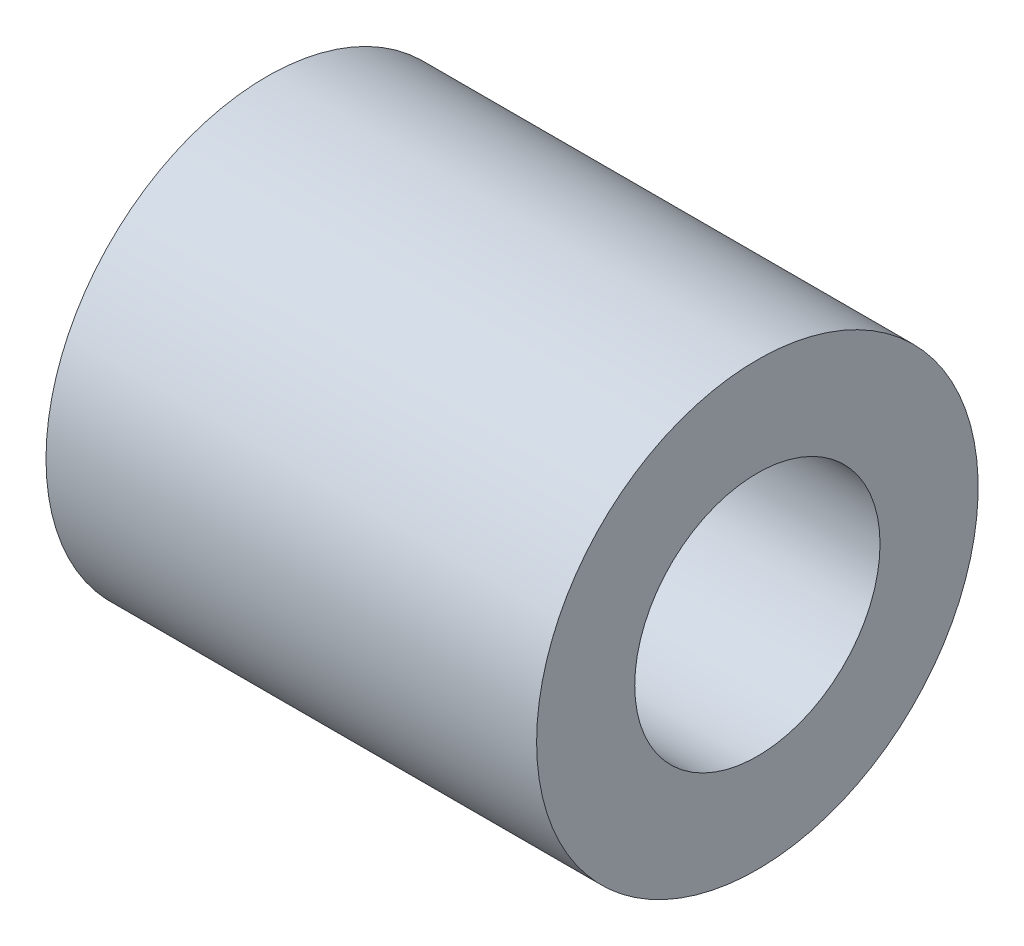
ISO-10303-21;
HEADER;
FILE_DESCRIPTION(('STEP AP214'),'2;1');
FILE_NAME('part.step','',(''),(''),'','','');
FILE_SCHEMA(('AUTOMOTIVE_DESIGN { 1 0 10303 214 1 1 1 1 }'));
ENDSEC;
DATA;
#1=APPLICATION_CONTEXT('core data for automotive mechanical design processes');
#2=APPLICATION_PROTOCOL_DEFINITION('international standard','automotive_design',2000,#1);
#3=PRODUCT_CONTEXT('',#1,'mechanical');
#4=PRODUCT('Part','Part','',(#3));
#5=PRODUCT_RELATED_PRODUCT_CATEGORY('part','',(#4));
#6=PRODUCT_DEFINITION_FORMATION('','',#4);
#7=PRODUCT_DEFINITION_CONTEXT('part definition',#1,'design');
#8=PRODUCT_DEFINITION('design','',#6,#7);
#9=PRODUCT_DEFINITION_SHAPE('','',#8);
#10=(LENGTH_UNIT() NAMED_UNIT(*) SI_UNIT(.MILLI.,.METRE.));
#11=(NAMED_UNIT(*) PLANE_ANGLE_UNIT() SI_UNIT($,.RADIAN.));
#12=(NAMED_UNIT(*) SI_UNIT($,.STERADIAN.) SOLID_ANGLE_UNIT());
#13=UNCERTAINTY_MEASURE_WITH_UNIT(LENGTH_MEASURE(1.E-05),#10,'distance_accuracy_value','');
#14=(GEOMETRIC_REPRESENTATION_CONTEXT(3) GLOBAL_UNCERTAINTY_ASSIGNED_CONTEXT((#13)) GLOBAL_UNIT_ASSIGNED_CONTEXT((#10,
#11,#12)) REPRESENTATION_CONTEXT('',''));
#15=CARTESIAN_POINT('',(0.,0.,0.));
#16=DIRECTION('',(0.,0.,1.));
#17=DIRECTION('',(1.,0.,0.));
#18=AXIS2_PLACEMENT_3D('',#15,#16,#17);
#19=CARTESIAN_POINT('',(150.,37.5,0.));
#20=DIRECTION('',(-1.,0.,0.));
#21=DIRECTION('',(0.,0.,1.));
#22=AXIS2_PLACEMENT_3D('',#19,#20,#21);
#23=PLANE('',#22);
#24=CARTESIAN_POINT('',(150.,0.,0.));
#25=DIRECTION('',(-1.,0.,0.));
#26=DIRECTION('',(0.,0.,1.));
#27=AXIS2_PLACEMENT_3D('',#24,#25,#26);
#28=CIRCLE('',#27,67.5);
#29=CARTESIAN_POINT('',(150.,0.,67.5));
#30=VERTEX_POINT('',#29);
#31=EDGE_CURVE('E53',#30,#30,#28,.T.);
#32=ORIENTED_EDGE('',*,*,#31,.F.);
#33=EDGE_LOOP('',(#32));
#34=FACE_BOUND('',#33,.T.);
#35=CARTESIAN_POINT('',(150.,0.,0.));
#36=DIRECTION('',(-1.,0.,0.));
#37=DIRECTION('',(0.,0.,1.));
#38=AXIS2_PLACEMENT_3D('',#35,#36,#37);
#39=CIRCLE('',#38,37.5);
#40=CARTESIAN_POINT('',(150.,0.,37.5));
#41=VERTEX_POINT('',#40);
#42=EDGE_CURVE('E10',#41,#41,#39,.T.);
#43=ORIENTED_EDGE('',*,*,#42,.T.);
#44=EDGE_LOOP('',(#43));
#45=FACE_BOUND('',#44,.T.);
#46=ADVANCED_FACE('F39',(#34,#45),#23,.F.);
#47=CARTESIAN_POINT('',(0.,0.,0.));
#48=DIRECTION('',(-1.,0.,0.));
#49=DIRECTION('',(0.,0.,1.));
#50=AXIS2_PLACEMENT_3D('',#47,#48,#49);
#51=CYLINDRICAL_SURFACE('',#50,37.5);
#52=ORIENTED_EDGE('',*,*,#42,.F.);
#53=EDGE_LOOP('',(#52));
#54=FACE_BOUND('',#53,.T.);
#55=CARTESIAN_POINT('',(0.,0.,0.));
#56=DIRECTION('',(-1.,0.,0.));
#57=DIRECTION('',(0.,0.,1.));
#58=AXIS2_PLACEMENT_3D('',#55,#56,#57);
#59=CIRCLE('',#58,37.5);
#60=CARTESIAN_POINT('',(0.,0.,37.5));
#61=VERTEX_POINT('',#60);
#62=EDGE_CURVE('E45',#61,#61,#59,.T.);
#63=ORIENTED_EDGE('',*,*,#62,.T.);
#64=EDGE_LOOP('',(#63));
#65=FACE_BOUND('',#64,.T.);
#66=ADVANCED_FACE('F62',(#54,#65),#51,.F.);
#67=CARTESIAN_POINT('',(0.,37.5,0.));
#68=DIRECTION('',(1.,0.,0.));
#69=DIRECTION('',(0.,0.,-1.));
#70=AXIS2_PLACEMENT_3D('',#67,#68,#69);
#71=PLANE('',#70);
#72=ORIENTED_EDGE('',*,*,#62,.F.);
#73=EDGE_LOOP('',(#72));
#74=FACE_BOUND('',#73,.T.);
#75=CARTESIAN_POINT('',(0.,0.,0.));
#76=DIRECTION('',(-1.,0.,0.));
#77=DIRECTION('',(0.,0.,1.));
#78=AXIS2_PLACEMENT_3D('',#75,#76,#77);
#79=CIRCLE('',#78,67.5);
#80=CARTESIAN_POINT('',(0.,0.,67.5));
#81=VERTEX_POINT('',#80);
#82=EDGE_CURVE('E49',#81,#81,#79,.T.);
#83=ORIENTED_EDGE('',*,*,#82,.T.);
#84=EDGE_LOOP('',(#83));
#85=FACE_BOUND('',#84,.T.);
#86=ADVANCED_FACE('F66',(#74,#85),#71,.F.);
#87=CARTESIAN_POINT('',(0.,0.,0.));
#88=DIRECTION('',(-1.,0.,0.));
#89=DIRECTION('',(0.,0.,1.));
#90=AXIS2_PLACEMENT_3D('',#87,#88,#89);
#91=CYLINDRICAL_SURFACE('',#90,67.5);
#92=ORIENTED_EDGE('',*,*,#82,.F.);
#93=EDGE_LOOP('',(#92));
#94=FACE_BOUND('',#93,.T.);
#95=ORIENTED_EDGE('',*,*,#31,.T.);
#96=EDGE_LOOP('',(#95));
#97=FACE_BOUND('',#96,.T.);
#98=ADVANCED_FACE('F59',(#94,#97),#91,.T.);
#99=CLOSED_SHELL('',(#46,#66,#86,#98));
#100=MANIFOLD_SOLID_BREP('B2',#99);
#101=ADVANCED_BREP_SHAPE_REPRESENTATION('',(#18,#100),#14);
#102=SHAPE_DEFINITION_REPRESENTATION(#9,#101);
ENDSEC;
END-ISO-10303-21;
